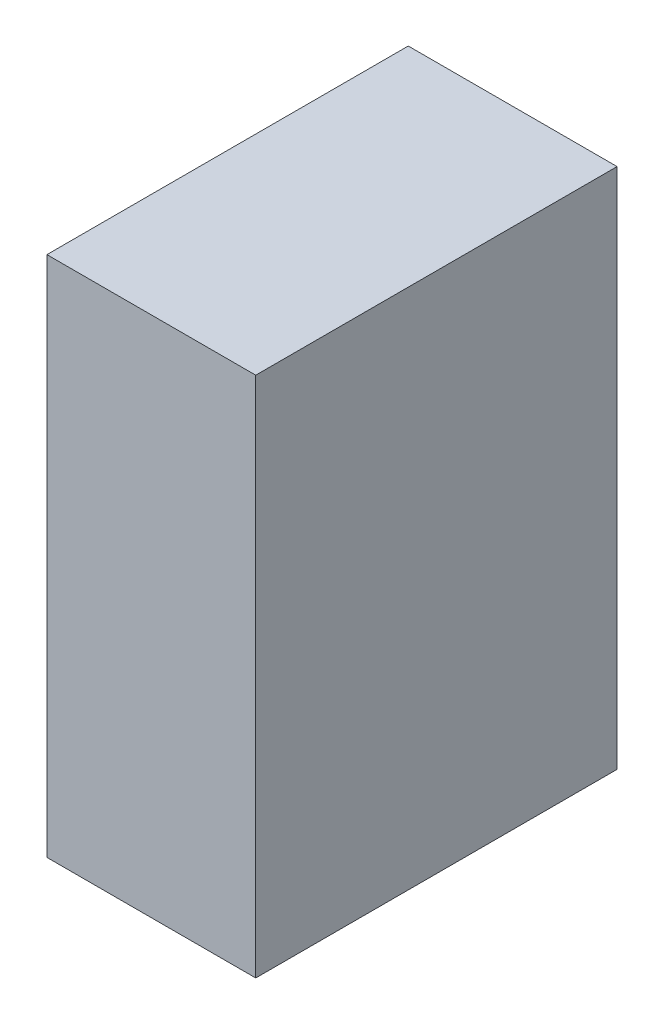
ISO-10303-21;
HEADER;
FILE_DESCRIPTION(('STEP AP214'),'2;1');
FILE_NAME('part.step','',(''),(''),'','','');
FILE_SCHEMA(('AUTOMOTIVE_DESIGN { 1 0 10303 214 1 1 1 1 }'));
ENDSEC;
DATA;
#1=APPLICATION_CONTEXT('core data for automotive mechanical design processes');
#2=APPLICATION_PROTOCOL_DEFINITION('international standard','automotive_design',2000,#1);
#3=PRODUCT_CONTEXT('',#1,'mechanical');
#4=PRODUCT('Part','Part','',(#3));
#5=PRODUCT_RELATED_PRODUCT_CATEGORY('part','',(#4));
#6=PRODUCT_DEFINITION_FORMATION('','',#4);
#7=PRODUCT_DEFINITION_CONTEXT('part definition',#1,'design');
#8=PRODUCT_DEFINITION('design','',#6,#7);
#9=PRODUCT_DEFINITION_SHAPE('','',#8);
#10=(LENGTH_UNIT() NAMED_UNIT(*) SI_UNIT(.MILLI.,.METRE.));
#11=(NAMED_UNIT(*) PLANE_ANGLE_UNIT() SI_UNIT($,.RADIAN.));
#12=(NAMED_UNIT(*) SI_UNIT($,.STERADIAN.) SOLID_ANGLE_UNIT());
#13=UNCERTAINTY_MEASURE_WITH_UNIT(LENGTH_MEASURE(1.E-05),#10,'distance_accuracy_value','');
#14=(GEOMETRIC_REPRESENTATION_CONTEXT(3) GLOBAL_UNCERTAINTY_ASSIGNED_CONTEXT((#13)) GLOBAL_UNIT_ASSIGNED_CONTEXT((#10,
#11,#12)) REPRESENTATION_CONTEXT('',''));
#15=CARTESIAN_POINT('',(0.,0.,0.));
#16=DIRECTION('',(0.,0.,1.));
#17=DIRECTION('',(1.,0.,0.));
#18=AXIS2_PLACEMENT_3D('',#15,#16,#17);
#19=CARTESIAN_POINT('',(12.7,31.75,43.95));
#20=DIRECTION('',(-1.,0.,0.));
#21=DIRECTION('',(0.,-1.,0.));
#22=AXIS2_PLACEMENT_3D('',#19,#20,#21);
#23=PLANE('',#22);
#24=DIRECTION('',(0.,1.,0.));
#25=VECTOR('',#24,1.);
#26=CARTESIAN_POINT('',(12.7,31.75,0.));
#27=LINE('',#26,#25);
#28=CARTESIAN_POINT('',(12.7,-31.75,0.));
#29=VERTEX_POINT('',#28);
#30=CARTESIAN_POINT('',(12.7,31.75,0.));
#31=VERTEX_POINT('',#30);
#32=EDGE_CURVE('E95',#29,#31,#27,.T.);
#33=ORIENTED_EDGE('',*,*,#32,.T.);
#34=DIRECTION('',(0.,0.,-1.));
#35=VECTOR('',#34,1.);
#36=CARTESIAN_POINT('',(12.7,31.75,43.95));
#37=LINE('',#36,#35);
#38=CARTESIAN_POINT('',(12.7,31.75,43.95));
#39=VERTEX_POINT('',#38);
#40=EDGE_CURVE('E11',#39,#31,#37,.T.);
#41=ORIENTED_EDGE('',*,*,#40,.F.);
#42=DIRECTION('',(0.,1.,0.));
#43=VECTOR('',#42,1.);
#44=CARTESIAN_POINT('',(12.7,31.75,43.95));
#45=LINE('',#44,#43);
#46=CARTESIAN_POINT('',(12.7,-31.75,43.95));
#47=VERTEX_POINT('',#46);
#48=EDGE_CURVE('E83',#47,#39,#45,.T.);
#49=ORIENTED_EDGE('',*,*,#48,.F.);
#50=DIRECTION('',(0.,0.,-1.));
#51=VECTOR('',#50,1.);
#52=CARTESIAN_POINT('',(12.7,-31.75,43.95));
#53=LINE('',#52,#51);
#54=EDGE_CURVE('E91',#47,#29,#53,.T.);
#55=ORIENTED_EDGE('',*,*,#54,.T.);
#56=EDGE_LOOP('',(#33,#41,#49,#55));
#57=FACE_BOUND('',#56,.T.);
#58=ADVANCED_FACE('F32',(#57),#23,.F.);
#59=CARTESIAN_POINT('',(-12.7,31.75,43.95));
#60=DIRECTION('',(0.,-1.,0.));
#61=DIRECTION('',(0.,0.,-1.));
#62=AXIS2_PLACEMENT_3D('',#59,#60,#61);
#63=PLANE('',#62);
#64=DIRECTION('',(-1.,0.,0.));
#65=VECTOR('',#64,1.);
#66=CARTESIAN_POINT('',(-12.7,31.75,0.));
#67=LINE('',#66,#65);
#68=CARTESIAN_POINT('',(-12.7,31.75,0.));
#69=VERTEX_POINT('',#68);
#70=EDGE_CURVE('E87',#31,#69,#67,.T.);
#71=ORIENTED_EDGE('',*,*,#70,.T.);
#72=DIRECTION('',(0.,0.,-1.));
#73=VECTOR('',#72,1.);
#74=CARTESIAN_POINT('',(-12.7,31.75,43.95));
#75=LINE('',#74,#73);
#76=CARTESIAN_POINT('',(-12.7,31.75,43.95));
#77=VERTEX_POINT('',#76);
#78=EDGE_CURVE('E40',#77,#69,#75,.T.);
#79=ORIENTED_EDGE('',*,*,#78,.F.);
#80=DIRECTION('',(-1.,0.,0.));
#81=VECTOR('',#80,1.);
#82=CARTESIAN_POINT('',(-12.7,31.75,43.95));
#83=LINE('',#82,#81);
#84=EDGE_CURVE('E78',#39,#77,#83,.T.);
#85=ORIENTED_EDGE('',*,*,#84,.F.);
#86=ORIENTED_EDGE('',*,*,#40,.T.);
#87=EDGE_LOOP('',(#71,#79,#85,#86));
#88=FACE_BOUND('',#87,.T.);
#89=ADVANCED_FACE('F86',(#88),#63,.F.);
#90=CARTESIAN_POINT('',(-12.7,31.75,43.95));
#91=DIRECTION('',(1.,0.,0.));
#92=DIRECTION('',(0.,1.,0.));
#93=AXIS2_PLACEMENT_3D('',#90,#91,#92);
#94=PLANE('',#93);
#95=DIRECTION('',(0.,-1.,0.));
#96=VECTOR('',#95,1.);
#97=CARTESIAN_POINT('',(-12.7,31.75,0.));
#98=LINE('',#97,#96);
#99=CARTESIAN_POINT('',(-12.7,-31.75,0.));
#100=VERTEX_POINT('',#99);
#101=EDGE_CURVE('E65',#69,#100,#98,.T.);
#102=ORIENTED_EDGE('',*,*,#101,.T.);
#103=DIRECTION('',(0.,0.,-1.));
#104=VECTOR('',#103,1.);
#105=CARTESIAN_POINT('',(-12.7,-31.75,43.95));
#106=LINE('',#105,#104);
#107=CARTESIAN_POINT('',(-12.7,-31.75,43.95));
#108=VERTEX_POINT('',#107);
#109=EDGE_CURVE('E88',#108,#100,#106,.T.);
#110=ORIENTED_EDGE('',*,*,#109,.F.);
#111=DIRECTION('',(0.,-1.,0.));
#112=VECTOR('',#111,1.);
#113=CARTESIAN_POINT('',(-12.7,31.75,43.95));
#114=LINE('',#113,#112);
#115=EDGE_CURVE('E81',#77,#108,#114,.T.);
#116=ORIENTED_EDGE('',*,*,#115,.F.);
#117=ORIENTED_EDGE('',*,*,#78,.T.);
#118=EDGE_LOOP('',(#102,#110,#116,#117));
#119=FACE_BOUND('',#118,.T.);
#120=ADVANCED_FACE('F89',(#119),#94,.F.);
#121=CARTESIAN_POINT('',(-12.7,-31.75,43.95));
#122=DIRECTION('',(0.,1.,0.));
#123=DIRECTION('',(0.,0.,1.));
#124=AXIS2_PLACEMENT_3D('',#121,#122,#123);
#125=PLANE('',#124);
#126=DIRECTION('',(1.,0.,0.));
#127=VECTOR('',#126,1.);
#128=CARTESIAN_POINT('',(-12.7,-31.75,0.));
#129=LINE('',#128,#127);
#130=EDGE_CURVE('E71',#100,#29,#129,.T.);
#131=ORIENTED_EDGE('',*,*,#130,.T.);
#132=ORIENTED_EDGE('',*,*,#54,.F.);
#133=DIRECTION('',(1.,0.,0.));
#134=VECTOR('',#133,1.);
#135=CARTESIAN_POINT('',(-12.7,-31.75,43.95));
#136=LINE('',#135,#134);
#137=EDGE_CURVE('E48',#108,#47,#136,.T.);
#138=ORIENTED_EDGE('',*,*,#137,.F.);
#139=ORIENTED_EDGE('',*,*,#109,.T.);
#140=EDGE_LOOP('',(#131,#132,#138,#139));
#141=FACE_BOUND('',#140,.T.);
#142=ADVANCED_FACE('F102',(#141),#125,.F.);
#143=CARTESIAN_POINT('',(0.,0.,43.95));
#144=DIRECTION('',(0.,0.,1.));
#145=DIRECTION('',(1.,0.,0.));
#146=AXIS2_PLACEMENT_3D('',#143,#144,#145);
#147=PLANE('',#146);
#148=ORIENTED_EDGE('',*,*,#48,.T.);
#149=ORIENTED_EDGE('',*,*,#84,.T.);
#150=ORIENTED_EDGE('',*,*,#115,.T.);
#151=ORIENTED_EDGE('',*,*,#137,.T.);
#152=EDGE_LOOP('',(#148,#149,#150,#151));
#153=FACE_BOUND('',#152,.T.);
#154=ADVANCED_FACE('F79',(#153),#147,.T.);
#155=CARTESIAN_POINT('',(0.,0.,0.));
#156=DIRECTION('',(0.,0.,1.));
#157=DIRECTION('',(1.,0.,0.));
#158=AXIS2_PLACEMENT_3D('',#155,#156,#157);
#159=PLANE('',#158);
#160=ORIENTED_EDGE('',*,*,#32,.F.);
#161=ORIENTED_EDGE('',*,*,#130,.F.);
#162=ORIENTED_EDGE('',*,*,#101,.F.);
#163=ORIENTED_EDGE('',*,*,#70,.F.);
#164=EDGE_LOOP('',(#160,#161,#162,#163));
#165=FACE_BOUND('',#164,.T.);
#166=ADVANCED_FACE('F105',(#165),#159,.F.);
#167=CLOSED_SHELL('',(#58,#89,#120,#142,#154,#166));
#168=MANIFOLD_SOLID_BREP('B2',#167);
#169=ADVANCED_BREP_SHAPE_REPRESENTATION('',(#18,#168),#14);
#170=SHAPE_DEFINITION_REPRESENTATION(#9,#169);
ENDSEC;
END-ISO-10303-21;
